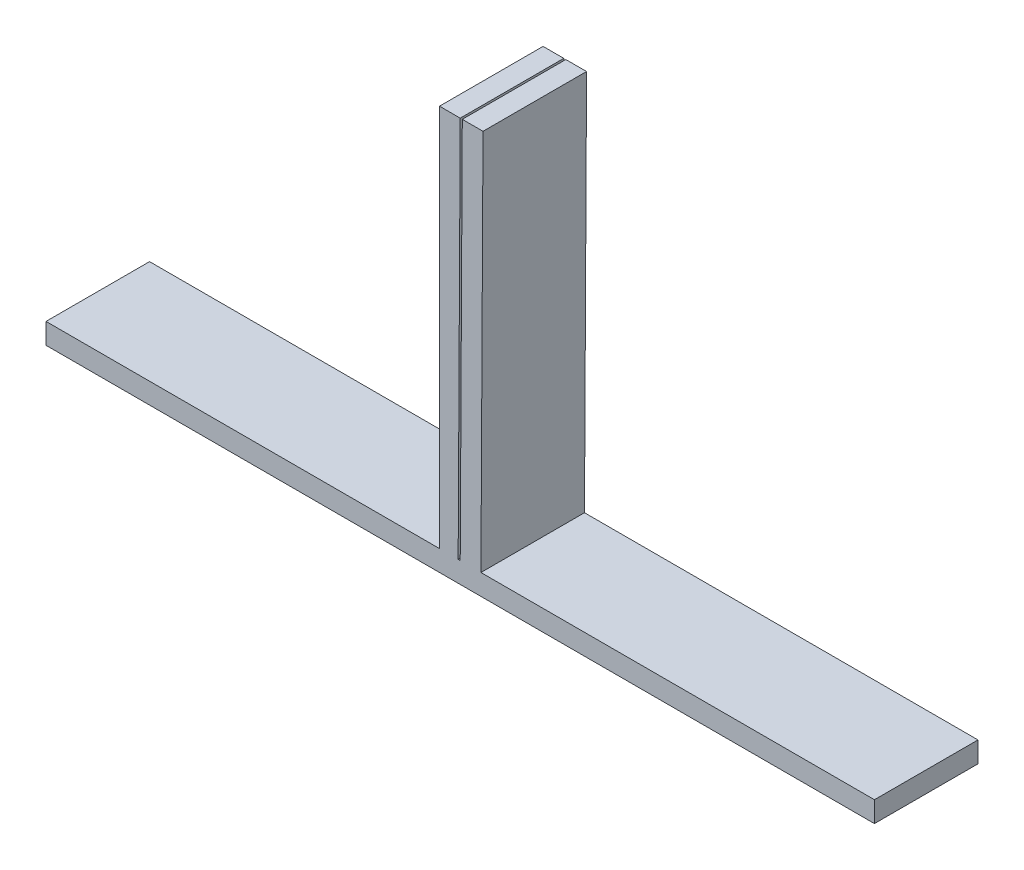
ISO-10303-21;
HEADER;
FILE_DESCRIPTION(('STEP AP214'),'2;1');
FILE_NAME('part.step','',(''),(''),'','','');
FILE_SCHEMA(('AUTOMOTIVE_DESIGN { 1 0 10303 214 1 1 1 1 }'));
ENDSEC;
DATA;
#1=APPLICATION_CONTEXT('core data for automotive mechanical design processes');
#2=APPLICATION_PROTOCOL_DEFINITION('international standard','automotive_design',2000,#1);
#3=PRODUCT_CONTEXT('',#1,'mechanical');
#4=PRODUCT('Part','Part','',(#3));
#5=PRODUCT_RELATED_PRODUCT_CATEGORY('part','',(#4));
#6=PRODUCT_DEFINITION_FORMATION('','',#4);
#7=PRODUCT_DEFINITION_CONTEXT('part definition',#1,'design');
#8=PRODUCT_DEFINITION('design','',#6,#7);
#9=PRODUCT_DEFINITION_SHAPE('','',#8);
#10=(LENGTH_UNIT() NAMED_UNIT(*) SI_UNIT(.MILLI.,.METRE.));
#11=(NAMED_UNIT(*) PLANE_ANGLE_UNIT() SI_UNIT($,.RADIAN.));
#12=(NAMED_UNIT(*) SI_UNIT($,.STERADIAN.) SOLID_ANGLE_UNIT());
#13=UNCERTAINTY_MEASURE_WITH_UNIT(LENGTH_MEASURE(1.E-05),#10,'distance_accuracy_value','');
#14=(GEOMETRIC_REPRESENTATION_CONTEXT(3) GLOBAL_UNCERTAINTY_ASSIGNED_CONTEXT((#13)) GLOBAL_UNIT_ASSIGNED_CONTEXT((#10,
#11,#12)) REPRESENTATION_CONTEXT('',''));
#15=CARTESIAN_POINT('',(0.,0.,0.));
#16=DIRECTION('',(0.,0.,1.));
#17=DIRECTION('',(1.,0.,0.));
#18=AXIS2_PLACEMENT_3D('',#15,#16,#17);
#19=CARTESIAN_POINT('',(37.1967164120741,0.,10.));
#20=DIRECTION('',(-1.,0.,0.));
#21=DIRECTION('',(0.,0.,1.));
#22=AXIS2_PLACEMENT_3D('',#19,#20,#21);
#23=PLANE('',#22);
#24=DIRECTION('',(0.,1.,0.));
#25=VECTOR('',#24,1.);
#26=CARTESIAN_POINT('',(37.1967164120741,0.,0.));
#27=LINE('',#26,#25);
#28=CARTESIAN_POINT('',(37.1967164120741,0.,0.));
#29=VERTEX_POINT('',#28);
#30=CARTESIAN_POINT('',(37.1967164120741,2.,0.));
#31=VERTEX_POINT('',#30);
#32=EDGE_CURVE('E153',#29,#31,#27,.T.);
#33=ORIENTED_EDGE('',*,*,#32,.T.);
#34=DIRECTION('',(0.,0.,-1.));
#35=VECTOR('',#34,1.);
#36=CARTESIAN_POINT('',(37.1967164120741,2.,10.));
#37=LINE('',#36,#35);
#38=CARTESIAN_POINT('',(37.1967164120741,2.,10.));
#39=VERTEX_POINT('',#38);
#40=EDGE_CURVE('E11',#39,#31,#37,.T.);
#41=ORIENTED_EDGE('',*,*,#40,.F.);
#42=DIRECTION('',(0.,1.,0.));
#43=VECTOR('',#42,1.);
#44=CARTESIAN_POINT('',(37.1967164120741,0.,10.));
#45=LINE('',#44,#43);
#46=CARTESIAN_POINT('',(37.1967164120741,0.,10.));
#47=VERTEX_POINT('',#46);
#48=EDGE_CURVE('E175',#47,#39,#45,.T.);
#49=ORIENTED_EDGE('',*,*,#48,.F.);
#50=DIRECTION('',(0.,0.,-1.));
#51=VECTOR('',#50,1.);
#52=CARTESIAN_POINT('',(37.1967164120741,0.,10.));
#53=LINE('',#52,#51);
#54=EDGE_CURVE('E149',#47,#29,#53,.T.);
#55=ORIENTED_EDGE('',*,*,#54,.T.);
#56=EDGE_LOOP('',(#33,#41,#49,#55));
#57=FACE_BOUND('',#56,.T.);
#58=ADVANCED_FACE('F33',(#57),#23,.F.);
#59=CARTESIAN_POINT('',(37.1967164120741,2.,10.));
#60=DIRECTION('',(0.,-1.,0.));
#61=DIRECTION('',(1.,0.,0.));
#62=AXIS2_PLACEMENT_3D('',#59,#60,#61);
#63=PLANE('',#62);
#64=DIRECTION('',(-1.,0.,0.));
#65=VECTOR('',#64,1.);
#66=CARTESIAN_POINT('',(37.1967164120741,2.,0.));
#67=LINE('',#66,#65);
#68=CARTESIAN_POINT('',(-0.803283587925897,2.,0.));
#69=VERTEX_POINT('',#68);
#70=EDGE_CURVE('E156',#31,#69,#67,.T.);
#71=ORIENTED_EDGE('',*,*,#70,.T.);
#72=DIRECTION('',(0.,0.,-1.));
#73=VECTOR('',#72,1.);
#74=CARTESIAN_POINT('',(-0.803283587925897,2.,10.));
#75=LINE('',#74,#73);
#76=CARTESIAN_POINT('',(-0.803283587925897,2.,10.));
#77=VERTEX_POINT('',#76);
#78=EDGE_CURVE('E41',#77,#69,#75,.T.);
#79=ORIENTED_EDGE('',*,*,#78,.F.);
#80=DIRECTION('',(-1.,0.,0.));
#81=VECTOR('',#80,1.);
#82=CARTESIAN_POINT('',(37.1967164120741,2.,10.));
#83=LINE('',#82,#81);
#84=EDGE_CURVE('E104',#39,#77,#83,.T.);
#85=ORIENTED_EDGE('',*,*,#84,.F.);
#86=ORIENTED_EDGE('',*,*,#40,.T.);
#87=EDGE_LOOP('',(#71,#79,#85,#86));
#88=FACE_BOUND('',#87,.T.);
#89=ADVANCED_FACE('F253',(#88),#63,.F.);
#90=CARTESIAN_POINT('',(-0.803283587925897,2.,10.));
#91=DIRECTION('',(-0.999985390700157,0.00540540343116233,0.));
#92=DIRECTION('',(-0.00540540343116233,-0.999985390700157,0.));
#93=AXIS2_PLACEMENT_3D('',#90,#91,#92);
#94=PLANE('',#93);
#95=DIRECTION('',(0.00540540343116233,0.999985390700158,0.));
#96=VECTOR('',#95,1.);
#97=CARTESIAN_POINT('',(-0.803283587925897,2.,0.));
#98=LINE('',#97,#96);
#99=CARTESIAN_POINT('',(-0.603283660972891,38.9994594559058,0.));
#100=VERTEX_POINT('',#99);
#101=EDGE_CURVE('E158',#69,#100,#98,.T.);
#102=ORIENTED_EDGE('',*,*,#101,.T.);
#103=DIRECTION('',(0.,0.,-1.));
#104=VECTOR('',#103,1.);
#105=CARTESIAN_POINT('',(-0.603283660972891,38.9994594559058,10.));
#106=LINE('',#105,#104);
#107=CARTESIAN_POINT('',(-0.603283660972891,38.9994594559058,10.));
#108=VERTEX_POINT('',#107);
#109=EDGE_CURVE('E194',#108,#100,#106,.T.);
#110=ORIENTED_EDGE('',*,*,#109,.F.);
#111=DIRECTION('',(0.00540540343116233,0.999985390700158,0.));
#112=VECTOR('',#111,1.);
#113=CARTESIAN_POINT('',(-0.803283587925897,2.,10.));
#114=LINE('',#113,#112);
#115=EDGE_CURVE('E202',#77,#108,#114,.T.);
#116=ORIENTED_EDGE('',*,*,#115,.F.);
#117=ORIENTED_EDGE('',*,*,#78,.T.);
#118=EDGE_LOOP('',(#102,#110,#116,#117));
#119=FACE_BOUND('',#118,.T.);
#120=ADVANCED_FACE('F200',(#119),#94,.F.);
#121=CARTESIAN_POINT('',(-0.603283660972891,38.9994594559058,10.));
#122=DIRECTION('',(-0.000270272047089848,-0.99999996347651,0.));
#123=DIRECTION('',(0.99999996347651,-0.000270272047089848,0.));
#124=AXIS2_PLACEMENT_3D('',#121,#122,#123);
#125=PLANE('',#124);
#126=DIRECTION('',(-0.99999996347651,0.000270272047089848,0.));
#127=VECTOR('',#126,1.);
#128=CARTESIAN_POINT('',(-0.603283660972891,38.9994594559058,0.));
#129=LINE('',#128,#127);
#130=CARTESIAN_POINT('',(-2.60328358792591,39.,0.));
#131=VERTEX_POINT('',#130);
#132=EDGE_CURVE('E160',#100,#131,#129,.T.);
#133=ORIENTED_EDGE('',*,*,#132,.T.);
#134=DIRECTION('',(0.,0.,-1.));
#135=VECTOR('',#134,1.);
#136=CARTESIAN_POINT('',(-2.60328358792591,39.,10.));
#137=LINE('',#136,#135);
#138=CARTESIAN_POINT('',(-2.60328358792591,39.,10.));
#139=VERTEX_POINT('',#138);
#140=EDGE_CURVE('E191',#139,#131,#137,.T.);
#141=ORIENTED_EDGE('',*,*,#140,.F.);
#142=DIRECTION('',(-0.99999996347651,0.000270272047089848,0.));
#143=VECTOR('',#142,1.);
#144=CARTESIAN_POINT('',(-0.603283660972891,38.9994594559058,10.));
#145=LINE('',#144,#143);
#146=EDGE_CURVE('E220',#108,#139,#145,.T.);
#147=ORIENTED_EDGE('',*,*,#146,.F.);
#148=ORIENTED_EDGE('',*,*,#109,.T.);
#149=EDGE_LOOP('',(#133,#141,#147,#148));
#150=FACE_BOUND('',#149,.T.);
#151=ADVANCED_FACE('F211',(#150),#125,.F.);
#152=CARTESIAN_POINT('',(-2.60328358792591,39.,10.));
#153=DIRECTION('',(0.99998539061834,-0.005405418567181,0.));
#154=DIRECTION('',(0.005405418567181,0.99998539061834,0.));
#155=AXIS2_PLACEMENT_3D('',#152,#153,#154);
#156=PLANE('',#155);
#157=DIRECTION('',(-0.005405418567181,-0.99998539061834,0.));
#158=VECTOR('',#157,1.);
#159=CARTESIAN_POINT('',(-2.60328358792591,39.,0.));
#160=LINE('',#159,#158);
#161=CARTESIAN_POINT('',(-2.80328407491161,2.00054054712143,0.));
#162=VERTEX_POINT('',#161);
#163=EDGE_CURVE('E162',#131,#162,#160,.T.);
#164=ORIENTED_EDGE('',*,*,#163,.T.);
#165=DIRECTION('',(0.,0.,-1.));
#166=VECTOR('',#165,1.);
#167=CARTESIAN_POINT('',(-2.80328407491161,2.00054054712143,10.));
#168=LINE('',#167,#166);
#169=CARTESIAN_POINT('',(-2.80328407491161,2.00054054712143,10.));
#170=VERTEX_POINT('',#169);
#171=EDGE_CURVE('E188',#170,#162,#168,.T.);
#172=ORIENTED_EDGE('',*,*,#171,.F.);
#173=DIRECTION('',(-0.005405418567181,-0.99998539061834,0.));
#174=VECTOR('',#173,1.);
#175=CARTESIAN_POINT('',(-2.60328358792591,39.,10.));
#176=LINE('',#175,#174);
#177=EDGE_CURVE('E217',#139,#170,#176,.T.);
#178=ORIENTED_EDGE('',*,*,#177,.F.);
#179=ORIENTED_EDGE('',*,*,#140,.T.);
#180=EDGE_LOOP('',(#164,#172,#178,#179));
#181=FACE_BOUND('',#180,.T.);
#182=ADVANCED_FACE('F215',(#181),#156,.F.);
#183=CARTESIAN_POINT('',(-2.80328407491161,2.00054054712143,10.));
#184=DIRECTION('',(0.,-1.,0.));
#185=DIRECTION('',(1.,0.,0.));
#186=AXIS2_PLACEMENT_3D('',#183,#184,#185);
#187=PLANE('',#186);
#188=DIRECTION('',(-1.,0.,0.));
#189=VECTOR('',#188,1.);
#190=CARTESIAN_POINT('',(-2.80328407491161,2.00054054712143,0.));
#191=LINE('',#190,#189);
#192=CARTESIAN_POINT('',(-3.00328407491161,2.00054054712142,0.));
#193=VERTEX_POINT('',#192);
#194=EDGE_CURVE('E164',#162,#193,#191,.T.);
#195=ORIENTED_EDGE('',*,*,#194,.T.);
#196=DIRECTION('',(0.,0.,-1.));
#197=VECTOR('',#196,1.);
#198=CARTESIAN_POINT('',(-3.00328407491161,2.00054054712142,10.));
#199=LINE('',#198,#197);
#200=CARTESIAN_POINT('',(-3.00328407491161,2.00054054712142,10.));
#201=VERTEX_POINT('',#200);
#202=EDGE_CURVE('E185',#201,#193,#199,.T.);
#203=ORIENTED_EDGE('',*,*,#202,.F.);
#204=DIRECTION('',(-1.,0.,0.));
#205=VECTOR('',#204,1.);
#206=CARTESIAN_POINT('',(-2.80328407491161,2.00054054712143,10.));
#207=LINE('',#206,#205);
#208=EDGE_CURVE('E219',#170,#201,#207,.T.);
#209=ORIENTED_EDGE('',*,*,#208,.F.);
#210=ORIENTED_EDGE('',*,*,#171,.T.);
#211=EDGE_LOOP('',(#195,#203,#209,#210));
#212=FACE_BOUND('',#211,.T.);
#213=ADVANCED_FACE('F266',(#212),#187,.F.);
#214=CARTESIAN_POINT('',(-3.00328407491161,2.00054054712142,10.));
#215=DIRECTION('',(-0.99998539061834,0.00540541856718098,0.));
#216=DIRECTION('',(-0.00540541856718098,-0.99998539061834,0.));
#217=AXIS2_PLACEMENT_3D('',#214,#215,#216);
#218=PLANE('',#217);
#219=DIRECTION('',(0.00540541856718098,0.99998539061834,0.));
#220=VECTOR('',#219,1.);
#221=CARTESIAN_POINT('',(-3.00328407491161,2.00054054712142,0.));
#222=LINE('',#221,#220);
#223=CARTESIAN_POINT('',(-2.80328358792591,39.,0.));
#224=VERTEX_POINT('',#223);
#225=EDGE_CURVE('E166',#193,#224,#222,.T.);
#226=ORIENTED_EDGE('',*,*,#225,.T.);
#227=DIRECTION('',(0.,0.,-1.));
#228=VECTOR('',#227,1.);
#229=CARTESIAN_POINT('',(-2.80328358792591,39.,10.));
#230=LINE('',#229,#228);
#231=CARTESIAN_POINT('',(-2.80328358792591,39.,10.));
#232=VERTEX_POINT('',#231);
#233=EDGE_CURVE('E182',#232,#224,#230,.T.);
#234=ORIENTED_EDGE('',*,*,#233,.F.);
#235=DIRECTION('',(0.00540541856718098,0.99998539061834,0.));
#236=VECTOR('',#235,1.);
#237=CARTESIAN_POINT('',(-3.00328407491161,2.00054054712142,10.));
#238=LINE('',#237,#236);
#239=EDGE_CURVE('E222',#201,#232,#238,.T.);
#240=ORIENTED_EDGE('',*,*,#239,.F.);
#241=ORIENTED_EDGE('',*,*,#202,.T.);
#242=EDGE_LOOP('',(#226,#234,#240,#241));
#243=FACE_BOUND('',#242,.T.);
#244=ADVANCED_FACE('F269',(#243),#218,.F.);
#245=CARTESIAN_POINT('',(-2.80328358792591,39.,10.));
#246=DIRECTION('',(0.,-1.,0.));
#247=DIRECTION('',(0.,0.,-1.));
#248=AXIS2_PLACEMENT_3D('',#245,#246,#247);
#249=PLANE('',#248);
#250=DIRECTION('',(-1.,0.,0.));
#251=VECTOR('',#250,1.);
#252=CARTESIAN_POINT('',(-2.80328358792591,39.,0.));
#253=LINE('',#252,#251);
#254=CARTESIAN_POINT('',(-4.80328358792591,39.,0.));
#255=VERTEX_POINT('',#254);
#256=EDGE_CURVE('E168',#224,#255,#253,.T.);
#257=ORIENTED_EDGE('',*,*,#256,.T.);
#258=DIRECTION('',(0.,0.,-1.));
#259=VECTOR('',#258,1.);
#260=CARTESIAN_POINT('',(-4.80328358792591,39.,10.));
#261=LINE('',#260,#259);
#262=CARTESIAN_POINT('',(-4.80328358792591,39.,10.));
#263=VERTEX_POINT('',#262);
#264=EDGE_CURVE('E179',#263,#255,#261,.T.);
#265=ORIENTED_EDGE('',*,*,#264,.F.);
#266=DIRECTION('',(-1.,0.,0.));
#267=VECTOR('',#266,1.);
#268=CARTESIAN_POINT('',(-2.80328358792591,39.,10.));
#269=LINE('',#268,#267);
#270=EDGE_CURVE('E228',#232,#263,#269,.T.);
#271=ORIENTED_EDGE('',*,*,#270,.F.);
#272=ORIENTED_EDGE('',*,*,#233,.T.);
#273=EDGE_LOOP('',(#257,#265,#271,#272));
#274=FACE_BOUND('',#273,.T.);
#275=ADVANCED_FACE('F234',(#274),#249,.F.);
#276=CARTESIAN_POINT('',(-4.80328358792591,39.,10.));
#277=DIRECTION('',(1.,0.,0.));
#278=DIRECTION('',(0.,1.,0.));
#279=AXIS2_PLACEMENT_3D('',#276,#277,#278);
#280=PLANE('',#279);
#281=DIRECTION('',(0.,-1.,0.));
#282=VECTOR('',#281,1.);
#283=CARTESIAN_POINT('',(-4.80328358792591,39.,0.));
#284=LINE('',#283,#282);
#285=CARTESIAN_POINT('',(-4.80328358792591,2.,0.));
#286=VERTEX_POINT('',#285);
#287=EDGE_CURVE('E170',#255,#286,#284,.T.);
#288=ORIENTED_EDGE('',*,*,#287,.T.);
#289=DIRECTION('',(0.,0.,-1.));
#290=VECTOR('',#289,1.);
#291=CARTESIAN_POINT('',(-4.80328358792591,2.,10.));
#292=LINE('',#291,#290);
#293=CARTESIAN_POINT('',(-4.80328358792591,2.,10.));
#294=VERTEX_POINT('',#293);
#295=EDGE_CURVE('E144',#294,#286,#292,.T.);
#296=ORIENTED_EDGE('',*,*,#295,.F.);
#297=DIRECTION('',(0.,-1.,0.));
#298=VECTOR('',#297,1.);
#299=CARTESIAN_POINT('',(-4.80328358792591,39.,10.));
#300=LINE('',#299,#298);
#301=EDGE_CURVE('E135',#263,#294,#300,.T.);
#302=ORIENTED_EDGE('',*,*,#301,.F.);
#303=ORIENTED_EDGE('',*,*,#264,.T.);
#304=EDGE_LOOP('',(#288,#296,#302,#303));
#305=FACE_BOUND('',#304,.T.);
#306=ADVANCED_FACE('F238',(#305),#280,.F.);
#307=CARTESIAN_POINT('',(-4.80328358792591,2.,10.));
#308=DIRECTION('',(0.,-1.,0.));
#309=DIRECTION('',(1.,0.,0.));
#310=AXIS2_PLACEMENT_3D('',#307,#308,#309);
#311=PLANE('',#310);
#312=DIRECTION('',(-1.,0.,0.));
#313=VECTOR('',#312,1.);
#314=CARTESIAN_POINT('',(-4.80328358792591,2.,0.));
#315=LINE('',#314,#313);
#316=CARTESIAN_POINT('',(-42.8032835879259,1.99999999999999,0.));
#317=VERTEX_POINT('',#316);
#318=EDGE_CURVE('E143',#286,#317,#315,.T.);
#319=ORIENTED_EDGE('',*,*,#318,.T.);
#320=DIRECTION('',(0.,0.,-1.));
#321=VECTOR('',#320,1.);
#322=CARTESIAN_POINT('',(-42.8032835879259,1.99999999999999,10.));
#323=LINE('',#322,#321);
#324=CARTESIAN_POINT('',(-42.8032835879259,1.99999999999999,10.));
#325=VERTEX_POINT('',#324);
#326=EDGE_CURVE('E140',#325,#317,#323,.T.);
#327=ORIENTED_EDGE('',*,*,#326,.F.);
#328=DIRECTION('',(-1.,0.,0.));
#329=VECTOR('',#328,1.);
#330=CARTESIAN_POINT('',(-4.80328358792591,2.,10.));
#331=LINE('',#330,#329);
#332=EDGE_CURVE('E129',#294,#325,#331,.T.);
#333=ORIENTED_EDGE('',*,*,#332,.F.);
#334=ORIENTED_EDGE('',*,*,#295,.T.);
#335=EDGE_LOOP('',(#319,#327,#333,#334));
#336=FACE_BOUND('',#335,.T.);
#337=ADVANCED_FACE('F141',(#336),#311,.F.);
#338=CARTESIAN_POINT('',(-42.8032835879259,1.99999999999999,10.));
#339=DIRECTION('',(1.,0.,0.));
#340=DIRECTION('',(0.,0.,-1.));
#341=AXIS2_PLACEMENT_3D('',#338,#339,#340);
#342=PLANE('',#341);
#343=DIRECTION('',(0.,-1.,0.));
#344=VECTOR('',#343,1.);
#345=CARTESIAN_POINT('',(-42.8032835879259,1.99999999999999,0.));
#346=LINE('',#345,#344);
#347=CARTESIAN_POINT('',(-42.8032835879259,0.,0.));
#348=VERTEX_POINT('',#347);
#349=EDGE_CURVE('E90',#317,#348,#346,.T.);
#350=ORIENTED_EDGE('',*,*,#349,.T.);
#351=DIRECTION('',(0.,0.,-1.));
#352=VECTOR('',#351,1.);
#353=CARTESIAN_POINT('',(-42.8032835879259,0.,10.));
#354=LINE('',#353,#352);
#355=CARTESIAN_POINT('',(-42.8032835879259,0.,10.));
#356=VERTEX_POINT('',#355);
#357=EDGE_CURVE('E145',#356,#348,#354,.T.);
#358=ORIENTED_EDGE('',*,*,#357,.F.);
#359=DIRECTION('',(0.,-1.,0.));
#360=VECTOR('',#359,1.);
#361=CARTESIAN_POINT('',(-42.8032835879259,1.99999999999999,10.));
#362=LINE('',#361,#360);
#363=EDGE_CURVE('E133',#325,#356,#362,.T.);
#364=ORIENTED_EDGE('',*,*,#363,.F.);
#365=ORIENTED_EDGE('',*,*,#326,.T.);
#366=EDGE_LOOP('',(#350,#358,#364,#365));
#367=FACE_BOUND('',#366,.T.);
#368=ADVANCED_FACE('F147',(#367),#342,.F.);
#369=CARTESIAN_POINT('',(37.1967164120741,0.,10.));
#370=DIRECTION('',(0.,1.,0.));
#371=DIRECTION('',(0.,0.,1.));
#372=AXIS2_PLACEMENT_3D('',#369,#370,#371);
#373=PLANE('',#372);
#374=DIRECTION('',(1.,0.,0.));
#375=VECTOR('',#374,1.);
#376=CARTESIAN_POINT('',(37.1967164120741,0.,0.));
#377=LINE('',#376,#375);
#378=EDGE_CURVE('E96',#348,#29,#377,.T.);
#379=ORIENTED_EDGE('',*,*,#378,.T.);
#380=ORIENTED_EDGE('',*,*,#54,.F.);
#381=DIRECTION('',(1.,0.,0.));
#382=VECTOR('',#381,1.);
#383=CARTESIAN_POINT('',(37.1967164120741,0.,10.));
#384=LINE('',#383,#382);
#385=EDGE_CURVE('E49',#356,#47,#384,.T.);
#386=ORIENTED_EDGE('',*,*,#385,.F.);
#387=ORIENTED_EDGE('',*,*,#357,.T.);
#388=EDGE_LOOP('',(#379,#380,#386,#387));
#389=FACE_BOUND('',#388,.T.);
#390=ADVANCED_FACE('F242',(#389),#373,.F.);
#391=CARTESIAN_POINT('',(0.,0.,10.));
#392=DIRECTION('',(0.,0.,1.));
#393=DIRECTION('',(1.,0.,0.));
#394=AXIS2_PLACEMENT_3D('',#391,#392,#393);
#395=PLANE('',#394);
#396=ORIENTED_EDGE('',*,*,#48,.T.);
#397=ORIENTED_EDGE('',*,*,#84,.T.);
#398=ORIENTED_EDGE('',*,*,#115,.T.);
#399=ORIENTED_EDGE('',*,*,#146,.T.);
#400=ORIENTED_EDGE('',*,*,#177,.T.);
#401=ORIENTED_EDGE('',*,*,#208,.T.);
#402=ORIENTED_EDGE('',*,*,#239,.T.);
#403=ORIENTED_EDGE('',*,*,#270,.T.);
#404=ORIENTED_EDGE('',*,*,#301,.T.);
#405=ORIENTED_EDGE('',*,*,#332,.T.);
#406=ORIENTED_EDGE('',*,*,#363,.T.);
#407=ORIENTED_EDGE('',*,*,#385,.T.);
#408=EDGE_LOOP('',(#396,#397,#398,#399,#400,#401,#402,#403,#404,#405,#406,#407));
#409=FACE_BOUND('',#408,.T.);
#410=ADVANCED_FACE('F131',(#409),#395,.T.);
#411=CARTESIAN_POINT('',(0.,0.,0.));
#412=DIRECTION('',(0.,0.,1.));
#413=DIRECTION('',(1.,0.,0.));
#414=AXIS2_PLACEMENT_3D('',#411,#412,#413);
#415=PLANE('',#414);
#416=ORIENTED_EDGE('',*,*,#32,.F.);
#417=ORIENTED_EDGE('',*,*,#378,.F.);
#418=ORIENTED_EDGE('',*,*,#349,.F.);
#419=ORIENTED_EDGE('',*,*,#318,.F.);
#420=ORIENTED_EDGE('',*,*,#287,.F.);
#421=ORIENTED_EDGE('',*,*,#256,.F.);
#422=ORIENTED_EDGE('',*,*,#225,.F.);
#423=ORIENTED_EDGE('',*,*,#194,.F.);
#424=ORIENTED_EDGE('',*,*,#163,.F.);
#425=ORIENTED_EDGE('',*,*,#132,.F.);
#426=ORIENTED_EDGE('',*,*,#101,.F.);
#427=ORIENTED_EDGE('',*,*,#70,.F.);
#428=EDGE_LOOP('',(#416,#417,#418,#419,#420,#421,#422,#423,#424,#425,#426,#427));
#429=FACE_BOUND('',#428,.T.);
#430=ADVANCED_FACE('F206',(#429),#415,.F.);
#431=CLOSED_SHELL('',(#58,#89,#120,#151,#182,#213,#244,#275,#306,#337,#368,#390,#410,#430));
#432=MANIFOLD_SOLID_BREP('B2',#431);
#433=ADVANCED_BREP_SHAPE_REPRESENTATION('',(#18,#432),#14);
#434=SHAPE_DEFINITION_REPRESENTATION(#9,#433);
ENDSEC;
END-ISO-10303-21;
